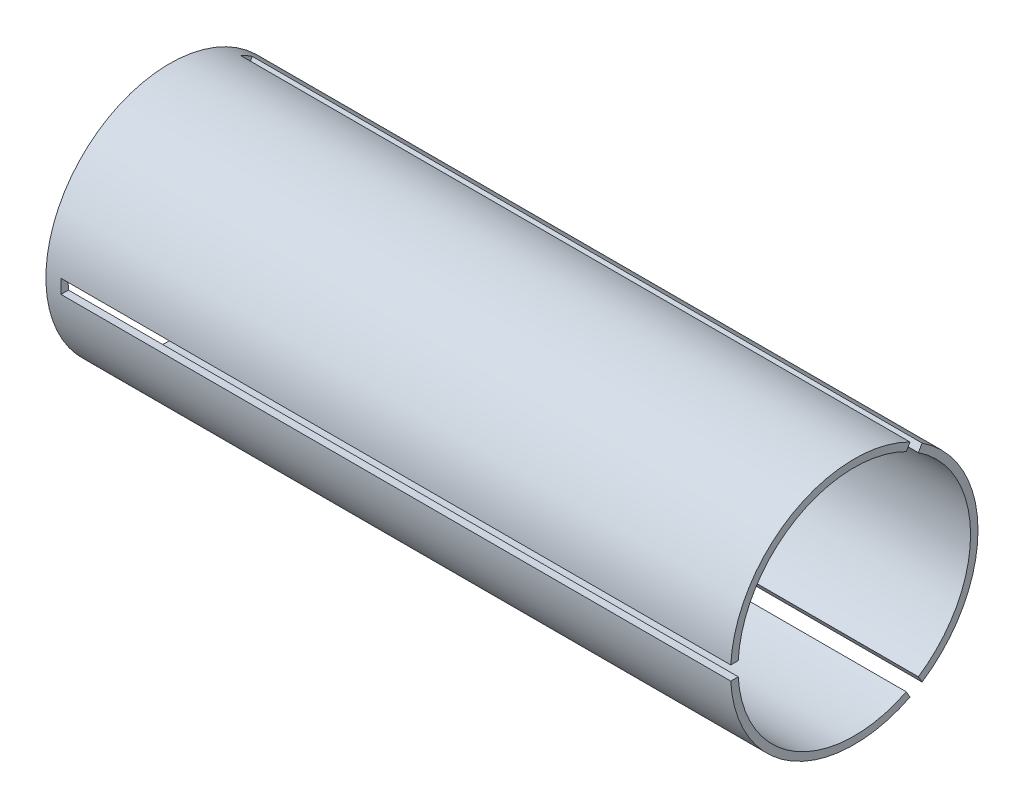
ISO-10303-21;
HEADER;
FILE_DESCRIPTION(('STEP AP214'),'2;1');
FILE_NAME('part.step','',(''),(''),'','','');
FILE_SCHEMA(('AUTOMOTIVE_DESIGN { 1 0 10303 214 1 1 1 1 }'));
ENDSEC;
DATA;
#1=APPLICATION_CONTEXT('core data for automotive mechanical design processes');
#2=APPLICATION_PROTOCOL_DEFINITION('international standard','automotive_design',2000,#1);
#3=PRODUCT_CONTEXT('',#1,'mechanical');
#4=PRODUCT('Part','Part','',(#3));
#5=PRODUCT_RELATED_PRODUCT_CATEGORY('part','',(#4));
#6=PRODUCT_DEFINITION_FORMATION('','',#4);
#7=PRODUCT_DEFINITION_CONTEXT('part definition',#1,'design');
#8=PRODUCT_DEFINITION('design','',#6,#7);
#9=PRODUCT_DEFINITION_SHAPE('','',#8);
#10=(LENGTH_UNIT() NAMED_UNIT(*) SI_UNIT(.MILLI.,.METRE.));
#11=(NAMED_UNIT(*) PLANE_ANGLE_UNIT() SI_UNIT($,.RADIAN.));
#12=(NAMED_UNIT(*) SI_UNIT($,.STERADIAN.) SOLID_ANGLE_UNIT());
#13=UNCERTAINTY_MEASURE_WITH_UNIT(LENGTH_MEASURE(1.E-05),#10,'distance_accuracy_value','');
#14=(GEOMETRIC_REPRESENTATION_CONTEXT(3) GLOBAL_UNCERTAINTY_ASSIGNED_CONTEXT((#13)) GLOBAL_UNIT_ASSIGNED_CONTEXT((#10,
#11,#12)) REPRESENTATION_CONTEXT('',''));
#15=CARTESIAN_POINT('',(0.,0.,0.));
#16=DIRECTION('',(0.,0.,1.));
#17=DIRECTION('',(1.,0.,0.));
#18=AXIS2_PLACEMENT_3D('',#15,#16,#17);
#19=CARTESIAN_POINT('',(233.68,0.,0.));
#20=DIRECTION('',(1.,0.,0.));
#21=DIRECTION('',(0.,0.,-1.));
#22=AXIS2_PLACEMENT_3D('',#19,#20,#21);
#23=PLANE('',#22);
#24=CARTESIAN_POINT('',(233.68,0.,0.));
#25=DIRECTION('',(1.,0.,0.));
#26=DIRECTION('',(0.,0.,-1.));
#27=AXIS2_PLACEMENT_3D('',#24,#25,#26);
#28=CIRCLE('',#27,39.6875);
#29=CARTESIAN_POINT('',(233.68,-33.117835742441,-21.870222037892));
#30=VERTEX_POINT('',#29);
#31=CARTESIAN_POINT('',(233.68,33.1178357424413,-21.8702220378915));
#32=VERTEX_POINT('',#31);
#33=EDGE_CURVE('E261',#30,#32,#28,.T.);
#34=ORIENTED_EDGE('',*,*,#33,.F.);
#35=DIRECTION('',(0.,0.866025403784436,0.500000000000004));
#36=VECTOR('',#35,1.);
#37=CARTESIAN_POINT('',(233.68,-48.7650438691536,-30.9041418619157));
#38=LINE('',#37,#36);
#39=CARTESIAN_POINT('',(233.68,-35.3212710547876,-23.1423760086172));
#40=VERTEX_POINT('',#39);
#41=EDGE_CURVE('E222',#40,#30,#38,.T.);
#42=ORIENTED_EDGE('',*,*,#41,.F.);
#43=CARTESIAN_POINT('',(233.68,0.,0.));
#44=DIRECTION('',(1.,0.,0.));
#45=DIRECTION('',(0.,0.,-1.));
#46=AXIS2_PLACEMENT_3D('',#43,#44,#45);
#47=CIRCLE('',#46,42.2275);
#48=CARTESIAN_POINT('',(233.68,35.321271054788,-23.1423760086167));
#49=VERTEX_POINT('',#48);
#50=EDGE_CURVE('E160',#40,#49,#47,.T.);
#51=ORIENTED_EDGE('',*,*,#50,.T.);
#52=DIRECTION('',(0.,-0.866025403784443,0.499999999999992));
#53=VECTOR('',#52,1.);
#54=CARTESIAN_POINT('',(233.68,48.7650438691539,-30.9041418619149));
#55=LINE('',#54,#53);
#56=EDGE_CURVE('E153',#49,#32,#55,.T.);
#57=ORIENTED_EDGE('',*,*,#56,.T.);
#58=EDGE_LOOP('',(#34,#42,#51,#57));
#59=FACE_BOUND('',#58,.T.);
#60=ADVANCED_FACE('F45',(#59),#23,.T.);
#61=CARTESIAN_POINT('',(233.68,-2.38125000000001,42.1603060317107));
#62=VERTEX_POINT('',#61);
#63=CARTESIAN_POINT('',(233.68,-37.7025210547877,-19.0179300230938));
#64=VERTEX_POINT('',#63);
#65=EDGE_CURVE('E163',#62,#64,#47,.T.);
#66=ORIENTED_EDGE('',*,*,#65,.T.);
#67=DIRECTION('',(0.,0.866025403784436,0.500000000000004));
#68=VECTOR('',#67,1.);
#69=CARTESIAN_POINT('',(233.68,-51.1462938691536,-26.7796958763923));
#70=LINE('',#69,#68);
#71=CARTESIAN_POINT('',(233.68,-35.4990857424411,-17.7457760523686));
#72=VERTEX_POINT('',#71);
#73=EDGE_CURVE('E284',#64,#72,#70,.T.);
#74=ORIENTED_EDGE('',*,*,#73,.T.);
#75=CARTESIAN_POINT('',(233.68,-2.38125000000001,39.6159980902602));
#76=VERTEX_POINT('',#75);
#77=EDGE_CURVE('E168',#76,#72,#28,.T.);
#78=ORIENTED_EDGE('',*,*,#77,.F.);
#79=DIRECTION('',(0.,0.,-1.));
#80=VECTOR('',#79,1.);
#81=CARTESIAN_POINT('',(233.68,-2.38125000000001,42.2275));
#82=LINE('',#81,#80);
#83=EDGE_CURVE('E240',#62,#76,#82,.T.);
#84=ORIENTED_EDGE('',*,*,#83,.F.);
#85=EDGE_LOOP('',(#66,#74,#78,#84));
#86=FACE_BOUND('',#85,.T.);
#87=ADVANCED_FACE('F305',(#86),#23,.T.);
#88=CARTESIAN_POINT('',(233.68,35.4990857424413,-17.7457760523681));
#89=VERTEX_POINT('',#88);
#90=CARTESIAN_POINT('',(233.68,2.38124999999999,39.6159980902602));
#91=VERTEX_POINT('',#90);
#92=EDGE_CURVE('E151',#89,#91,#28,.T.);
#93=ORIENTED_EDGE('',*,*,#92,.F.);
#94=DIRECTION('',(0.,-0.866025403784443,0.499999999999992));
#95=VECTOR('',#94,1.);
#96=CARTESIAN_POINT('',(233.68,51.1462938691538,-26.7796958763914));
#97=LINE('',#96,#95);
#98=CARTESIAN_POINT('',(233.68,37.7025210547879,-19.0179300230933));
#99=VERTEX_POINT('',#98);
#100=EDGE_CURVE('E69',#99,#89,#97,.T.);
#101=ORIENTED_EDGE('',*,*,#100,.F.);
#102=CARTESIAN_POINT('',(233.68,2.38124999999999,42.1603060317107));
#103=VERTEX_POINT('',#102);
#104=EDGE_CURVE('E149',#99,#103,#47,.T.);
#105=ORIENTED_EDGE('',*,*,#104,.T.);
#106=DIRECTION('',(0.,0.,-1.));
#107=VECTOR('',#106,1.);
#108=CARTESIAN_POINT('',(233.68,2.38124999999999,42.2275));
#109=LINE('',#108,#107);
#110=EDGE_CURVE('E237',#103,#91,#109,.T.);
#111=ORIENTED_EDGE('',*,*,#110,.T.);
#112=EDGE_LOOP('',(#93,#101,#105,#111));
#113=FACE_BOUND('',#112,.T.);
#114=ADVANCED_FACE('F147',(#113),#23,.T.);
#115=CARTESIAN_POINT('',(233.68,0.,0.));
#116=DIRECTION('',(-1.,0.,0.));
#117=DIRECTION('',(0.,0.,1.));
#118=AXIS2_PLACEMENT_3D('',#115,#116,#117);
#119=CYLINDRICAL_SURFACE('',#118,42.2275);
#120=CARTESIAN_POINT('',(0.,0.,0.));
#121=DIRECTION('',(1.,0.,0.));
#122=DIRECTION('',(0.,0.,-1.));
#123=AXIS2_PLACEMENT_3D('',#120,#121,#122);
#124=CIRCLE('',#123,42.2275);
#125=CARTESIAN_POINT('',(0.,0.,-42.2275));
#126=VERTEX_POINT('',#125);
#127=EDGE_CURVE('E161',#126,#126,#124,.T.);
#128=ORIENTED_EDGE('',*,*,#127,.T.);
#129=EDGE_LOOP('',(#128));
#130=FACE_BOUND('',#129,.T.);
#131=DIRECTION('',(-1.,0.,0.));
#132=VECTOR('',#131,1.);
#133=CARTESIAN_POINT('',(233.68,-35.3212710547876,-23.1423760086172));
#134=LINE('',#133,#132);
#135=CARTESIAN_POINT('',(5.07999999999997,-35.3212710547876,-23.1423760086172));
#136=VERTEX_POINT('',#135);
#137=EDGE_CURVE('E234',#136,#40,#134,.F.);
#138=ORIENTED_EDGE('',*,*,#137,.F.);
#139=CARTESIAN_POINT('',(5.07999999999997,0.,0.));
#140=DIRECTION('',(1.,0.,0.));
#141=DIRECTION('',(0.,0.,-1.));
#142=AXIS2_PLACEMENT_3D('',#139,#140,#141);
#143=CIRCLE('',#142,42.2275);
#144=CARTESIAN_POINT('',(5.07999999999997,-37.7025210547876,-19.0179300230939));
#145=VERTEX_POINT('',#144);
#146=EDGE_CURVE('E228',#145,#136,#143,.T.);
#147=ORIENTED_EDGE('',*,*,#146,.F.);
#148=DIRECTION('',(-1.,0.,0.));
#149=VECTOR('',#148,1.);
#150=CARTESIAN_POINT('',(233.68,-37.7025210547877,-19.0179300230938));
#151=LINE('',#150,#149);
#152=EDGE_CURVE('E218',#64,#145,#151,.T.);
#153=ORIENTED_EDGE('',*,*,#152,.F.);
#154=ORIENTED_EDGE('',*,*,#65,.F.);
#155=DIRECTION('',(-1.,0.,0.));
#156=VECTOR('',#155,1.);
#157=CARTESIAN_POINT('',(233.68,-2.38125000000001,42.1603060317107));
#158=LINE('',#157,#156);
#159=CARTESIAN_POINT('',(5.07999999999997,-2.38125000000003,42.1603060317107));
#160=VERTEX_POINT('',#159);
#161=EDGE_CURVE('E251',#160,#62,#158,.F.);
#162=ORIENTED_EDGE('',*,*,#161,.F.);
#163=CARTESIAN_POINT('',(5.07999999999997,0.,0.));
#164=DIRECTION('',(1.,0.,0.));
#165=DIRECTION('',(0.,0.,-1.));
#166=AXIS2_PLACEMENT_3D('',#163,#164,#165);
#167=CIRCLE('',#166,42.2275);
#168=CARTESIAN_POINT('',(5.07999999999997,2.38124999999997,42.1603060317107));
#169=VERTEX_POINT('',#168);
#170=EDGE_CURVE('E254',#169,#160,#167,.T.);
#171=ORIENTED_EDGE('',*,*,#170,.F.);
#172=DIRECTION('',(-1.,0.,0.));
#173=VECTOR('',#172,1.);
#174=CARTESIAN_POINT('',(233.68,2.38124999999999,42.1603060317107));
#175=LINE('',#174,#173);
#176=EDGE_CURVE('E158',#103,#169,#175,.T.);
#177=ORIENTED_EDGE('',*,*,#176,.F.);
#178=ORIENTED_EDGE('',*,*,#104,.F.);
#179=DIRECTION('',(-1.,0.,0.));
#180=VECTOR('',#179,1.);
#181=CARTESIAN_POINT('',(233.68,37.7025210547879,-19.0179300230933));
#182=LINE('',#181,#180);
#183=CARTESIAN_POINT('',(5.07999999999997,37.7025210547879,-19.0179300230933));
#184=VERTEX_POINT('',#183);
#185=EDGE_CURVE('E134',#184,#99,#182,.F.);
#186=ORIENTED_EDGE('',*,*,#185,.F.);
#187=CARTESIAN_POINT('',(5.07999999999997,35.321271054788,-23.1423760086167));
#188=VERTEX_POINT('',#187);
#189=EDGE_CURVE('E231',#188,#184,#143,.T.);
#190=ORIENTED_EDGE('',*,*,#189,.F.);
#191=DIRECTION('',(-1.,0.,0.));
#192=VECTOR('',#191,1.);
#193=CARTESIAN_POINT('',(233.68,35.321271054788,-23.1423760086167));
#194=LINE('',#193,#192);
#195=EDGE_CURVE('E142',#49,#188,#194,.T.);
#196=ORIENTED_EDGE('',*,*,#195,.F.);
#197=ORIENTED_EDGE('',*,*,#50,.F.);
#198=EDGE_LOOP('',(#138,#147,#153,#154,#162,#171,#177,#178,#186,#190,#196,#197));
#199=FACE_BOUND('',#198,.T.);
#200=ADVANCED_FACE('F47',(#130,#199),#119,.T.);
#201=CARTESIAN_POINT('',(233.68,0.,0.));
#202=DIRECTION('',(-1.,0.,0.));
#203=DIRECTION('',(0.,0.,1.));
#204=AXIS2_PLACEMENT_3D('',#201,#202,#203);
#205=CYLINDRICAL_SURFACE('',#204,39.6875);
#206=CARTESIAN_POINT('',(0.,0.,0.));
#207=DIRECTION('',(1.,0.,0.));
#208=DIRECTION('',(0.,0.,-1.));
#209=AXIS2_PLACEMENT_3D('',#206,#207,#208);
#210=CIRCLE('',#209,39.6875);
#211=CARTESIAN_POINT('',(0.,0.,-39.6875));
#212=VERTEX_POINT('',#211);
#213=EDGE_CURVE('E259',#212,#212,#210,.T.);
#214=ORIENTED_EDGE('',*,*,#213,.F.);
#215=EDGE_LOOP('',(#214));
#216=FACE_BOUND('',#215,.T.);
#217=CARTESIAN_POINT('',(5.07999999999997,0.,0.));
#218=DIRECTION('',(1.,0.,0.));
#219=DIRECTION('',(0.,0.,-1.));
#220=AXIS2_PLACEMENT_3D('',#217,#218,#219);
#221=CIRCLE('',#220,39.6875);
#222=CARTESIAN_POINT('',(5.07999999999997,-35.499085742441,-17.7457760523686));
#223=VERTEX_POINT('',#222);
#224=CARTESIAN_POINT('',(5.07999999999997,-33.117835742441,-21.870222037892));
#225=VERTEX_POINT('',#224);
#226=EDGE_CURVE('E201',#223,#225,#221,.T.);
#227=ORIENTED_EDGE('',*,*,#226,.T.);
#228=DIRECTION('',(-1.,0.,0.));
#229=VECTOR('',#228,1.);
#230=CARTESIAN_POINT('',(233.68,-33.117835742441,-21.870222037892));
#231=LINE('',#230,#229);
#232=EDGE_CURVE('E11',#225,#30,#231,.F.);
#233=ORIENTED_EDGE('',*,*,#232,.T.);
#234=ORIENTED_EDGE('',*,*,#33,.T.);
#235=DIRECTION('',(-1.,0.,0.));
#236=VECTOR('',#235,1.);
#237=CARTESIAN_POINT('',(233.68,33.1178357424413,-21.8702220378915));
#238=LINE('',#237,#236);
#239=CARTESIAN_POINT('',(5.07999999999997,33.1178357424414,-21.8702220378915));
#240=VERTEX_POINT('',#239);
#241=EDGE_CURVE('E200',#32,#240,#238,.T.);
#242=ORIENTED_EDGE('',*,*,#241,.T.);
#243=CARTESIAN_POINT('',(5.07999999999997,35.4990857424413,-17.745776052368));
#244=VERTEX_POINT('',#243);
#245=EDGE_CURVE('E196',#240,#244,#221,.T.);
#246=ORIENTED_EDGE('',*,*,#245,.T.);
#247=DIRECTION('',(-1.,0.,0.));
#248=VECTOR('',#247,1.);
#249=CARTESIAN_POINT('',(233.68,35.4990857424413,-17.7457760523681));
#250=LINE('',#249,#248);
#251=EDGE_CURVE('E193',#244,#89,#250,.F.);
#252=ORIENTED_EDGE('',*,*,#251,.T.);
#253=ORIENTED_EDGE('',*,*,#92,.T.);
#254=DIRECTION('',(-1.,0.,0.));
#255=VECTOR('',#254,1.);
#256=CARTESIAN_POINT('',(233.68,2.38124999999999,39.6159980902602));
#257=LINE('',#256,#255);
#258=CARTESIAN_POINT('',(5.07999999999997,2.38124999999997,39.6159980902602));
#259=VERTEX_POINT('',#258);
#260=EDGE_CURVE('E187',#91,#259,#257,.T.);
#261=ORIENTED_EDGE('',*,*,#260,.T.);
#262=CARTESIAN_POINT('',(5.07999999999997,0.,0.));
#263=DIRECTION('',(1.,0.,0.));
#264=DIRECTION('',(0.,0.,-1.));
#265=AXIS2_PLACEMENT_3D('',#262,#263,#264);
#266=CIRCLE('',#265,39.6875);
#267=CARTESIAN_POINT('',(5.07999999999997,-2.38125000000003,39.6159980902602));
#268=VERTEX_POINT('',#267);
#269=EDGE_CURVE('E180',#259,#268,#266,.T.);
#270=ORIENTED_EDGE('',*,*,#269,.T.);
#271=DIRECTION('',(-1.,0.,0.));
#272=VECTOR('',#271,1.);
#273=CARTESIAN_POINT('',(233.68,-2.38125000000001,39.6159980902602));
#274=LINE('',#273,#272);
#275=EDGE_CURVE('E173',#268,#76,#274,.F.);
#276=ORIENTED_EDGE('',*,*,#275,.T.);
#277=ORIENTED_EDGE('',*,*,#77,.T.);
#278=DIRECTION('',(-1.,0.,0.));
#279=VECTOR('',#278,1.);
#280=CARTESIAN_POINT('',(233.68,-35.4990857424411,-17.7457760523686));
#281=LINE('',#280,#279);
#282=EDGE_CURVE('E54',#72,#223,#281,.T.);
#283=ORIENTED_EDGE('',*,*,#282,.T.);
#284=EDGE_LOOP('',(#227,#233,#234,#242,#246,#252,#253,#261,#270,#276,#277,#283));
#285=FACE_BOUND('',#284,.T.);
#286=ADVANCED_FACE('F208',(#216,#285),#205,.F.);
#287=CARTESIAN_POINT('',(0.,0.,0.));
#288=DIRECTION('',(1.,0.,0.));
#289=DIRECTION('',(0.,0.,-1.));
#290=AXIS2_PLACEMENT_3D('',#287,#288,#289);
#291=PLANE('',#290);
#292=ORIENTED_EDGE('',*,*,#127,.F.);
#293=EDGE_LOOP('',(#292));
#294=FACE_BOUND('',#293,.T.);
#295=ORIENTED_EDGE('',*,*,#213,.T.);
#296=EDGE_LOOP('',(#295));
#297=FACE_BOUND('',#296,.T.);
#298=ADVANCED_FACE('F320',(#294,#297),#291,.F.);
#299=CARTESIAN_POINT('',(5.07999999999997,2.38124999999997,42.2275));
#300=DIRECTION('',(0.,-1.,0.));
#301=DIRECTION('',(1.,0.,0.));
#302=AXIS2_PLACEMENT_3D('',#299,#300,#301);
#303=PLANE('',#302);
#304=ORIENTED_EDGE('',*,*,#176,.T.);
#305=DIRECTION('',(0.,0.,-1.));
#306=VECTOR('',#305,1.);
#307=CARTESIAN_POINT('',(5.07999999999997,2.38124999999997,42.2275));
#308=LINE('',#307,#306);
#309=EDGE_CURVE('E247',#169,#259,#308,.T.);
#310=ORIENTED_EDGE('',*,*,#309,.T.);
#311=ORIENTED_EDGE('',*,*,#260,.F.);
#312=ORIENTED_EDGE('',*,*,#110,.F.);
#313=EDGE_LOOP('',(#304,#310,#311,#312));
#314=FACE_BOUND('',#313,.T.);
#315=ADVANCED_FACE('F325',(#314),#303,.T.);
#316=CARTESIAN_POINT('',(5.07999999999997,-2.38125000000003,42.2275));
#317=DIRECTION('',(1.,0.,0.));
#318=DIRECTION('',(0.,0.,-1.));
#319=AXIS2_PLACEMENT_3D('',#316,#317,#318);
#320=PLANE('',#319);
#321=ORIENTED_EDGE('',*,*,#170,.T.);
#322=DIRECTION('',(0.,0.,-1.));
#323=VECTOR('',#322,1.);
#324=CARTESIAN_POINT('',(5.07999999999997,-2.38125000000003,42.2275));
#325=LINE('',#324,#323);
#326=EDGE_CURVE('E243',#160,#268,#325,.T.);
#327=ORIENTED_EDGE('',*,*,#326,.T.);
#328=ORIENTED_EDGE('',*,*,#269,.F.);
#329=ORIENTED_EDGE('',*,*,#309,.F.);
#330=EDGE_LOOP('',(#321,#327,#328,#329));
#331=FACE_BOUND('',#330,.T.);
#332=ADVANCED_FACE('F329',(#331),#320,.T.);
#333=CARTESIAN_POINT('',(5.07999999999997,-2.38125000000003,42.2275));
#334=DIRECTION('',(0.,1.,0.));
#335=DIRECTION('',(-1.,0.,0.));
#336=AXIS2_PLACEMENT_3D('',#333,#334,#335);
#337=PLANE('',#336);
#338=ORIENTED_EDGE('',*,*,#161,.T.);
#339=ORIENTED_EDGE('',*,*,#83,.T.);
#340=ORIENTED_EDGE('',*,*,#275,.F.);
#341=ORIENTED_EDGE('',*,*,#326,.F.);
#342=EDGE_LOOP('',(#338,#339,#340,#341));
#343=FACE_BOUND('',#342,.T.);
#344=ADVANCED_FACE('F335',(#343),#337,.T.);
#345=CARTESIAN_POINT('',(5.07999999999997,51.1462938691538,-26.7796958763914));
#346=DIRECTION('',(0.,-0.499999999999992,-0.866025403784443));
#347=DIRECTION('',(0.,0.866025403784443,-0.499999999999992));
#348=AXIS2_PLACEMENT_3D('',#345,#346,#347);
#349=PLANE('',#348);
#350=ORIENTED_EDGE('',*,*,#185,.T.);
#351=ORIENTED_EDGE('',*,*,#100,.T.);
#352=ORIENTED_EDGE('',*,*,#251,.F.);
#353=DIRECTION('',(0.,-0.866025403784443,0.499999999999992));
#354=VECTOR('',#353,1.);
#355=CARTESIAN_POINT('',(5.07999999999997,51.1462938691538,-26.7796958763914));
#356=LINE('',#355,#354);
#357=EDGE_CURVE('E137',#184,#244,#356,.T.);
#358=ORIENTED_EDGE('',*,*,#357,.F.);
#359=EDGE_LOOP('',(#350,#351,#352,#358));
#360=FACE_BOUND('',#359,.T.);
#361=ADVANCED_FACE('F135',(#360),#349,.T.);
#362=CARTESIAN_POINT('',(5.07999999999997,48.7650438691539,-30.9041418619148));
#363=DIRECTION('',(0.,0.499999999999992,0.866025403784443));
#364=DIRECTION('',(0.,-0.866025403784443,0.499999999999992));
#365=AXIS2_PLACEMENT_3D('',#362,#363,#364);
#366=PLANE('',#365);
#367=ORIENTED_EDGE('',*,*,#195,.T.);
#368=DIRECTION('',(0.,-0.866025403784443,0.499999999999992));
#369=VECTOR('',#368,1.);
#370=CARTESIAN_POINT('',(5.07999999999997,48.7650438691539,-30.9041418619148));
#371=LINE('',#370,#369);
#372=EDGE_CURVE('E280',#188,#240,#371,.T.);
#373=ORIENTED_EDGE('',*,*,#372,.T.);
#374=ORIENTED_EDGE('',*,*,#241,.F.);
#375=ORIENTED_EDGE('',*,*,#56,.F.);
#376=EDGE_LOOP('',(#367,#373,#374,#375));
#377=FACE_BOUND('',#376,.T.);
#378=ADVANCED_FACE('F290',(#377),#366,.T.);
#379=CARTESIAN_POINT('',(5.07999999999997,-48.7650438691536,-30.9041418619157));
#380=DIRECTION('',(1.,0.,0.));
#381=DIRECTION('',(0.,0.,-1.));
#382=AXIS2_PLACEMENT_3D('',#379,#380,#381);
#383=PLANE('',#382);
#384=ORIENTED_EDGE('',*,*,#189,.T.);
#385=ORIENTED_EDGE('',*,*,#357,.T.);
#386=ORIENTED_EDGE('',*,*,#245,.F.);
#387=ORIENTED_EDGE('',*,*,#372,.F.);
#388=EDGE_LOOP('',(#384,#385,#386,#387));
#389=FACE_BOUND('',#388,.T.);
#390=ADVANCED_FACE('F292',(#389),#383,.T.);
#391=CARTESIAN_POINT('',(5.07999999999997,-48.7650438691536,-30.9041418619157));
#392=DIRECTION('',(0.,-0.500000000000004,0.866025403784436));
#393=DIRECTION('',(0.,-0.866025403784436,-0.500000000000004));
#394=AXIS2_PLACEMENT_3D('',#391,#392,#393);
#395=PLANE('',#394);
#396=ORIENTED_EDGE('',*,*,#137,.T.);
#397=ORIENTED_EDGE('',*,*,#41,.T.);
#398=ORIENTED_EDGE('',*,*,#232,.F.);
#399=DIRECTION('',(0.,0.866025403784436,0.500000000000004));
#400=VECTOR('',#399,1.);
#401=CARTESIAN_POINT('',(5.07999999999997,-48.7650438691536,-30.9041418619157));
#402=LINE('',#401,#400);
#403=EDGE_CURVE('E61',#136,#225,#402,.T.);
#404=ORIENTED_EDGE('',*,*,#403,.F.);
#405=EDGE_LOOP('',(#396,#397,#398,#404));
#406=FACE_BOUND('',#405,.T.);
#407=ADVANCED_FACE('F288',(#406),#395,.T.);
#408=CARTESIAN_POINT('',(5.07999999999997,-51.1462938691536,-26.7796958763923));
#409=DIRECTION('',(0.,0.500000000000004,-0.866025403784436));
#410=DIRECTION('',(0.,0.866025403784436,0.500000000000004));
#411=AXIS2_PLACEMENT_3D('',#408,#409,#410);
#412=PLANE('',#411);
#413=ORIENTED_EDGE('',*,*,#152,.T.);
#414=DIRECTION('',(0.,0.866025403784436,0.500000000000004));
#415=VECTOR('',#414,1.);
#416=CARTESIAN_POINT('',(5.07999999999997,-51.1462938691536,-26.7796958763923));
#417=LINE('',#416,#415);
#418=EDGE_CURVE('E143',#145,#223,#417,.T.);
#419=ORIENTED_EDGE('',*,*,#418,.T.);
#420=ORIENTED_EDGE('',*,*,#282,.F.);
#421=ORIENTED_EDGE('',*,*,#73,.F.);
#422=EDGE_LOOP('',(#413,#419,#420,#421));
#423=FACE_BOUND('',#422,.T.);
#424=ADVANCED_FACE('F216',(#423),#412,.T.);
#425=ORIENTED_EDGE('',*,*,#146,.T.);
#426=ORIENTED_EDGE('',*,*,#403,.T.);
#427=ORIENTED_EDGE('',*,*,#226,.F.);
#428=ORIENTED_EDGE('',*,*,#418,.F.);
#429=EDGE_LOOP('',(#425,#426,#427,#428));
#430=FACE_BOUND('',#429,.T.);
#431=ADVANCED_FACE('F213',(#430),#383,.T.);
#432=CLOSED_SHELL('',(#60,#87,#114,#200,#286,#298,#315,#332,#344,#361,#378,#390,#407,#424,#431));
#433=MANIFOLD_SOLID_BREP('B2',#432);
#434=ADVANCED_BREP_SHAPE_REPRESENTATION('',(#18,#433),#14);
#435=SHAPE_DEFINITION_REPRESENTATION(#9,#434);
ENDSEC;
END-ISO-10303-21;
